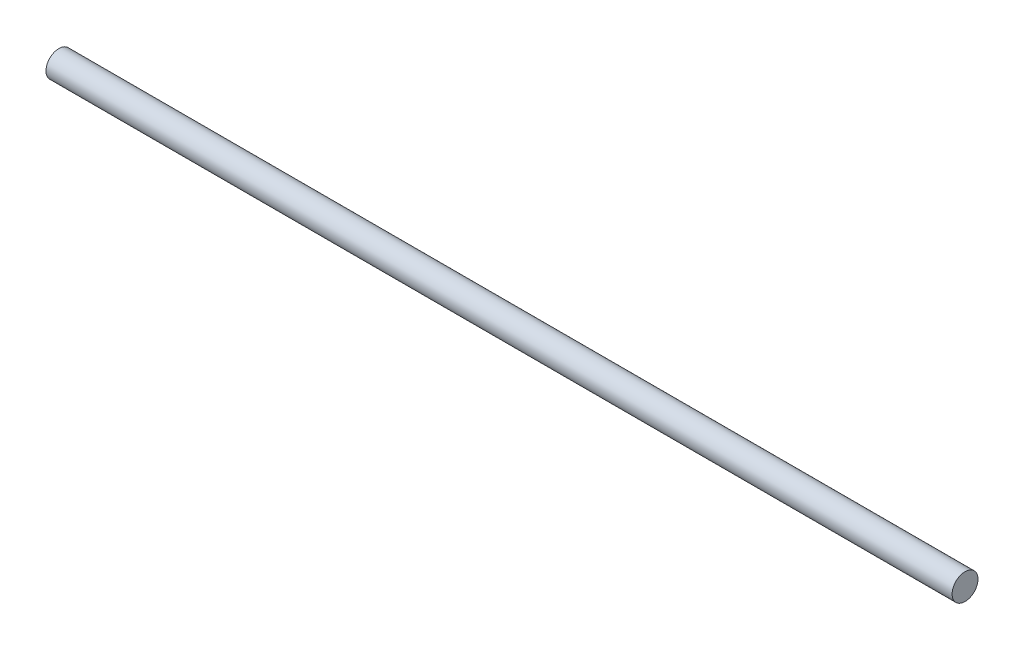
ISO-10303-21;
HEADER;
FILE_DESCRIPTION(('STEP AP214'),'2;1');
FILE_NAME('part.step','',(''),(''),'','','');
FILE_SCHEMA(('AUTOMOTIVE_DESIGN { 1 0 10303 214 1 1 1 1 }'));
ENDSEC;
DATA;
#1=APPLICATION_CONTEXT('core data for automotive mechanical design processes');
#2=APPLICATION_PROTOCOL_DEFINITION('international standard','automotive_design',2000,#1);
#3=PRODUCT_CONTEXT('',#1,'mechanical');
#4=PRODUCT('Part','Part','',(#3));
#5=PRODUCT_RELATED_PRODUCT_CATEGORY('part','',(#4));
#6=PRODUCT_DEFINITION_FORMATION('','',#4);
#7=PRODUCT_DEFINITION_CONTEXT('part definition',#1,'design');
#8=PRODUCT_DEFINITION('design','',#6,#7);
#9=PRODUCT_DEFINITION_SHAPE('','',#8);
#10=(LENGTH_UNIT() NAMED_UNIT(*) SI_UNIT(.MILLI.,.METRE.));
#11=(NAMED_UNIT(*) PLANE_ANGLE_UNIT() SI_UNIT($,.RADIAN.));
#12=(NAMED_UNIT(*) SI_UNIT($,.STERADIAN.) SOLID_ANGLE_UNIT());
#13=UNCERTAINTY_MEASURE_WITH_UNIT(LENGTH_MEASURE(1.E-05),#10,'distance_accuracy_value','');
#14=(GEOMETRIC_REPRESENTATION_CONTEXT(3) GLOBAL_UNCERTAINTY_ASSIGNED_CONTEXT((#13)) GLOBAL_UNIT_ASSIGNED_CONTEXT((#10,
#11,#12)) REPRESENTATION_CONTEXT('',''));
#15=CARTESIAN_POINT('',(0.,0.,0.));
#16=DIRECTION('',(0.,0.,1.));
#17=DIRECTION('',(1.,0.,0.));
#18=AXIS2_PLACEMENT_3D('',#15,#16,#17);
#19=CARTESIAN_POINT('',(170.,16.6527294583716,8.75496674285614));
#20=DIRECTION('',(-1.,0.,0.));
#21=DIRECTION('',(0.,0.,1.));
#22=AXIS2_PLACEMENT_3D('',#19,#20,#21);
#23=CYLINDRICAL_SURFACE('',#22,2.42930219179534);
#24=CARTESIAN_POINT('',(170.,16.6527294583716,8.75496674285614));
#25=DIRECTION('',(1.,0.,0.));
#26=DIRECTION('',(0.,0.,-1.));
#27=AXIS2_PLACEMENT_3D('',#24,#25,#26);
#28=CIRCLE('',#27,2.42930219179534);
#29=CARTESIAN_POINT('',(170.,16.6527294583716,6.3256645510608));
#30=VERTEX_POINT('',#29);
#31=EDGE_CURVE('E10',#30,#30,#28,.T.);
#32=ORIENTED_EDGE('',*,*,#31,.F.);
#33=EDGE_LOOP('',(#32));
#34=FACE_BOUND('',#33,.T.);
#35=CARTESIAN_POINT('',(0.,16.6527294583716,8.75496674285614));
#36=DIRECTION('',(1.,0.,0.));
#37=DIRECTION('',(0.,0.,-1.));
#38=AXIS2_PLACEMENT_3D('',#35,#36,#37);
#39=CIRCLE('',#38,2.42930219179534);
#40=CARTESIAN_POINT('',(0.,16.6527294583716,6.3256645510608));
#41=VERTEX_POINT('',#40);
#42=EDGE_CURVE('E36',#41,#41,#39,.T.);
#43=ORIENTED_EDGE('',*,*,#42,.T.);
#44=EDGE_LOOP('',(#43));
#45=FACE_BOUND('',#44,.T.);
#46=ADVANCED_FACE('F33',(#34,#45),#23,.T.);
#47=CARTESIAN_POINT('',(170.,16.6527294583716,8.75496674285614));
#48=DIRECTION('',(1.,0.,0.));
#49=DIRECTION('',(0.,0.,-1.));
#50=AXIS2_PLACEMENT_3D('',#47,#48,#49);
#51=PLANE('',#50);
#52=ORIENTED_EDGE('',*,*,#31,.T.);
#53=EDGE_LOOP('',(#52));
#54=FACE_BOUND('',#53,.T.);
#55=ADVANCED_FACE('F48',(#54),#51,.T.);
#56=CARTESIAN_POINT('',(0.,16.6527294583716,8.75496674285614));
#57=DIRECTION('',(1.,0.,0.));
#58=DIRECTION('',(0.,0.,-1.));
#59=AXIS2_PLACEMENT_3D('',#56,#57,#58);
#60=PLANE('',#59);
#61=ORIENTED_EDGE('',*,*,#42,.F.);
#62=EDGE_LOOP('',(#61));
#63=FACE_BOUND('',#62,.T.);
#64=ADVANCED_FACE('F46',(#63),#60,.F.);
#65=CLOSED_SHELL('',(#46,#55,#64));
#66=MANIFOLD_SOLID_BREP('B2',#65);
#67=ADVANCED_BREP_SHAPE_REPRESENTATION('',(#18,#66),#14);
#68=SHAPE_DEFINITION_REPRESENTATION(#9,#67);
ENDSEC;
END-ISO-10303-21;
